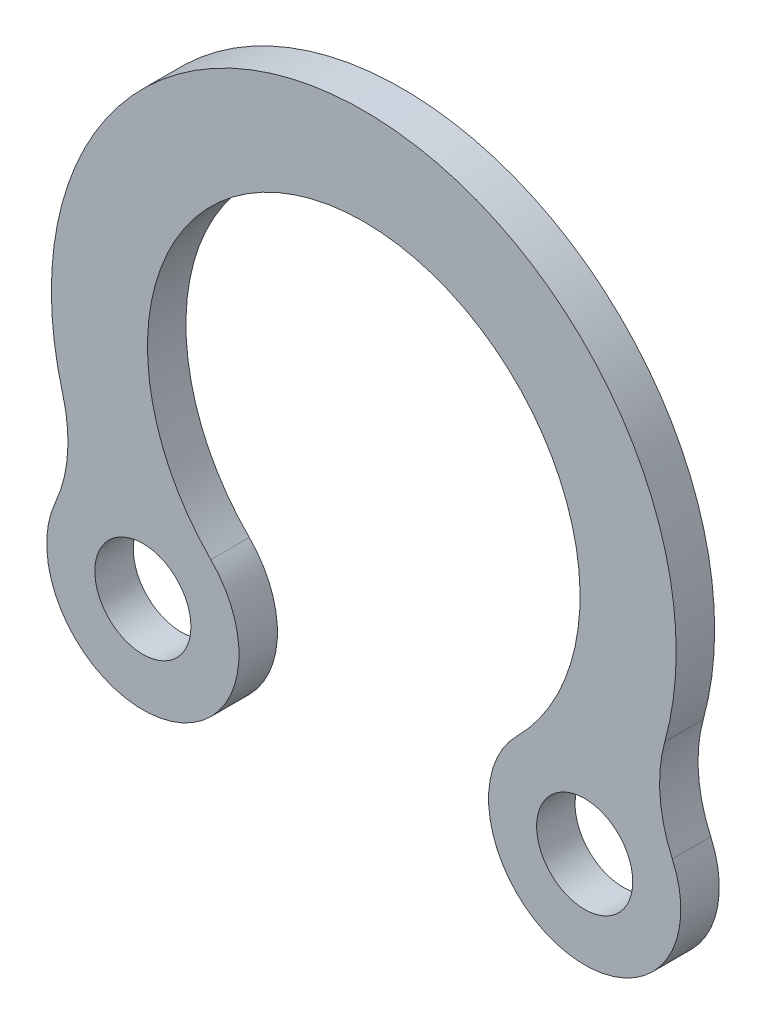
ISO-10303-21;
HEADER;
FILE_DESCRIPTION(('STEP AP214'),'2;1');
FILE_NAME('part.step','',(''),(''),'','','');
FILE_SCHEMA(('AUTOMOTIVE_DESIGN { 1 0 10303 214 1 1 1 1 }'));
ENDSEC;
DATA;
#1=APPLICATION_CONTEXT('core data for automotive mechanical design processes');
#2=APPLICATION_PROTOCOL_DEFINITION('international standard','automotive_design',2000,#1);
#3=PRODUCT_CONTEXT('',#1,'mechanical');
#4=PRODUCT('Part','Part','',(#3));
#5=PRODUCT_RELATED_PRODUCT_CATEGORY('part','',(#4));
#6=PRODUCT_DEFINITION_FORMATION('','',#4);
#7=PRODUCT_DEFINITION_CONTEXT('part definition',#1,'design');
#8=PRODUCT_DEFINITION('design','',#6,#7);
#9=PRODUCT_DEFINITION_SHAPE('','',#8);
#10=(LENGTH_UNIT() NAMED_UNIT(*) SI_UNIT(.MILLI.,.METRE.));
#11=(NAMED_UNIT(*) PLANE_ANGLE_UNIT() SI_UNIT($,.RADIAN.));
#12=(NAMED_UNIT(*) SI_UNIT($,.STERADIAN.) SOLID_ANGLE_UNIT());
#13=UNCERTAINTY_MEASURE_WITH_UNIT(LENGTH_MEASURE(1.E-05),#10,'distance_accuracy_value','');
#14=(GEOMETRIC_REPRESENTATION_CONTEXT(3) GLOBAL_UNCERTAINTY_ASSIGNED_CONTEXT((#13)) GLOBAL_UNIT_ASSIGNED_CONTEXT((#10,
#11,#12)) REPRESENTATION_CONTEXT('',''));
#15=CARTESIAN_POINT('',(0.,0.,0.));
#16=DIRECTION('',(0.,0.,1.));
#17=DIRECTION('',(1.,0.,0.));
#18=AXIS2_PLACEMENT_3D('',#15,#16,#17);
#19=CARTESIAN_POINT('',(0.,0.,0.8));
#20=DIRECTION('',(0.,0.,1.));
#21=DIRECTION('',(1.,0.,0.));
#22=AXIS2_PLACEMENT_3D('',#19,#20,#21);
#23=PLANE('',#22);
#24=CARTESIAN_POINT('',(-4.59619407771257,-4.59619407771255,0.8));
#25=DIRECTION('',(0.,0.,1.));
#26=DIRECTION('',(1.,0.,0.));
#27=AXIS2_PLACEMENT_3D('',#24,#25,#26);
#28=CIRCLE('',#27,1.);
#29=CARTESIAN_POINT('',(-3.59619407771257,-4.59619407771255,0.8));
#30=VERTEX_POINT('',#29);
#31=EDGE_CURVE('E156',#30,#30,#28,.T.);
#32=ORIENTED_EDGE('',*,*,#31,.F.);
#33=EDGE_LOOP('',(#32));
#34=FACE_BOUND('',#33,.T.);
#35=CARTESIAN_POINT('',(4.59619407771257,-4.59619407771255,0.8));
#36=DIRECTION('',(0.,0.,1.));
#37=DIRECTION('',(1.,0.,0.));
#38=AXIS2_PLACEMENT_3D('',#35,#36,#37);
#39=CIRCLE('',#38,1.);
#40=CARTESIAN_POINT('',(5.59619407771257,-4.59619407771255,0.8));
#41=VERTEX_POINT('',#40);
#42=EDGE_CURVE('E150',#41,#41,#39,.T.);
#43=ORIENTED_EDGE('',*,*,#42,.F.);
#44=EDGE_LOOP('',(#43));
#45=FACE_BOUND('',#44,.T.);
#46=CARTESIAN_POINT('',(0.,0.,0.8));
#47=DIRECTION('',(0.,0.,1.));
#48=DIRECTION('',(1.,0.,0.));
#49=AXIS2_PLACEMENT_3D('',#46,#47,#48);
#50=CIRCLE('',#49,6.5);
#51=CARTESIAN_POINT('',(6.26328155252438,-1.73818991879706,0.8));
#52=VERTEX_POINT('',#51);
#53=CARTESIAN_POINT('',(-6.26328155252438,-1.73818991879707,0.8));
#54=VERTEX_POINT('',#53);
#55=EDGE_CURVE('E117',#52,#54,#50,.T.);
#56=ORIENTED_EDGE('',*,*,#55,.T.);
#57=CARTESIAN_POINT('',(-9.15402688445872,-2.54043141978033,0.8));
#58=DIRECTION('',(0.,0.,1.));
#59=DIRECTION('',(1.,0.,0.));
#60=AXIS2_PLACEMENT_3D('',#57,#58,#59);
#61=CIRCLE('',#60,3.);
#62=CARTESIAN_POINT('',(-6.41932720041103,-3.77388901453966,0.8));
#63=VERTEX_POINT('',#62);
#64=EDGE_CURVE('E131',#54,#63,#61,.F.);
#65=ORIENTED_EDGE('',*,*,#64,.T.);
#66=CARTESIAN_POINT('',(-4.59619407771257,-4.59619407771255,0.8));
#67=DIRECTION('',(0.,0.,1.));
#68=DIRECTION('',(1.,0.,0.));
#69=AXIS2_PLACEMENT_3D('',#66,#67,#68);
#70=CIRCLE('',#69,2.);
#71=CARTESIAN_POINT('',(-3.18198051533947,-3.18198051533946,0.8));
#72=VERTEX_POINT('',#71);
#73=EDGE_CURVE('E94',#63,#72,#70,.T.);
#74=ORIENTED_EDGE('',*,*,#73,.T.);
#75=CARTESIAN_POINT('',(0.,0.,0.8));
#76=DIRECTION('',(0.,0.,1.));
#77=DIRECTION('',(1.,0.,0.));
#78=AXIS2_PLACEMENT_3D('',#75,#76,#77);
#79=CIRCLE('',#78,4.5);
#80=CARTESIAN_POINT('',(3.18198051533947,-3.18198051533946,0.8));
#81=VERTEX_POINT('',#80);
#82=EDGE_CURVE('E109',#81,#72,#79,.T.);
#83=ORIENTED_EDGE('',*,*,#82,.F.);
#84=CARTESIAN_POINT('',(4.59619407771257,-4.59619407771255,0.8));
#85=DIRECTION('',(0.,0.,1.));
#86=DIRECTION('',(1.,0.,0.));
#87=AXIS2_PLACEMENT_3D('',#84,#85,#86);
#88=CIRCLE('',#87,2.);
#89=CARTESIAN_POINT('',(6.41932720041103,-3.77388901453966,0.8));
#90=VERTEX_POINT('',#89);
#91=EDGE_CURVE('E95',#81,#90,#88,.T.);
#92=ORIENTED_EDGE('',*,*,#91,.T.);
#93=CARTESIAN_POINT('',(9.15402688445872,-2.54043141978033,0.8));
#94=DIRECTION('',(0.,0.,1.));
#95=DIRECTION('',(1.,0.,0.));
#96=AXIS2_PLACEMENT_3D('',#93,#94,#95);
#97=CIRCLE('',#96,3.);
#98=EDGE_CURVE('E11',#90,#52,#97,.F.);
#99=ORIENTED_EDGE('',*,*,#98,.T.);
#100=EDGE_LOOP('',(#56,#65,#74,#83,#92,#99));
#101=FACE_BOUND('',#100,.T.);
#102=ADVANCED_FACE('F39',(#34,#45,#101),#23,.T.);
#103=CARTESIAN_POINT('',(0.,0.,0.));
#104=DIRECTION('',(0.,0.,1.));
#105=DIRECTION('',(1.,0.,0.));
#106=AXIS2_PLACEMENT_3D('',#103,#104,#105);
#107=PLANE('',#106);
#108=CARTESIAN_POINT('',(-4.59619407771257,-4.59619407771255,0.));
#109=DIRECTION('',(0.,0.,1.));
#110=DIRECTION('',(1.,0.,0.));
#111=AXIS2_PLACEMENT_3D('',#108,#109,#110);
#112=CIRCLE('',#111,1.);
#113=CARTESIAN_POINT('',(-3.59619407771257,-4.59619407771255,0.));
#114=VERTEX_POINT('',#113);
#115=EDGE_CURVE('E104',#114,#114,#112,.T.);
#116=ORIENTED_EDGE('',*,*,#115,.T.);
#117=EDGE_LOOP('',(#116));
#118=FACE_BOUND('',#117,.T.);
#119=CARTESIAN_POINT('',(4.59619407771257,-4.59619407771255,0.));
#120=DIRECTION('',(0.,0.,1.));
#121=DIRECTION('',(1.,0.,0.));
#122=AXIS2_PLACEMENT_3D('',#119,#120,#121);
#123=CIRCLE('',#122,1.);
#124=CARTESIAN_POINT('',(5.59619407771257,-4.59619407771255,0.));
#125=VERTEX_POINT('',#124);
#126=EDGE_CURVE('E153',#125,#125,#123,.T.);
#127=ORIENTED_EDGE('',*,*,#126,.T.);
#128=EDGE_LOOP('',(#127));
#129=FACE_BOUND('',#128,.T.);
#130=CARTESIAN_POINT('',(0.,0.,0.));
#131=DIRECTION('',(0.,0.,1.));
#132=DIRECTION('',(1.,0.,0.));
#133=AXIS2_PLACEMENT_3D('',#130,#131,#132);
#134=CIRCLE('',#133,4.5);
#135=CARTESIAN_POINT('',(3.18198051533947,-3.18198051533946,0.));
#136=VERTEX_POINT('',#135);
#137=CARTESIAN_POINT('',(-3.18198051533947,-3.18198051533946,0.));
#138=VERTEX_POINT('',#137);
#139=EDGE_CURVE('E93',#136,#138,#134,.T.);
#140=ORIENTED_EDGE('',*,*,#139,.T.);
#141=CARTESIAN_POINT('',(-4.59619407771257,-4.59619407771255,0.));
#142=DIRECTION('',(0.,0.,1.));
#143=DIRECTION('',(1.,0.,0.));
#144=AXIS2_PLACEMENT_3D('',#141,#142,#143);
#145=CIRCLE('',#144,2.);
#146=CARTESIAN_POINT('',(-6.41932720041103,-3.77388901453966,0.));
#147=VERTEX_POINT('',#146);
#148=EDGE_CURVE('E110',#147,#138,#145,.T.);
#149=ORIENTED_EDGE('',*,*,#148,.F.);
#150=CARTESIAN_POINT('',(-9.15402688445872,-2.54043141978033,0.));
#151=DIRECTION('',(0.,0.,1.));
#152=DIRECTION('',(1.,0.,0.));
#153=AXIS2_PLACEMENT_3D('',#150,#151,#152);
#154=CIRCLE('',#153,3.);
#155=CARTESIAN_POINT('',(-6.26328155252438,-1.73818991879707,0.));
#156=VERTEX_POINT('',#155);
#157=EDGE_CURVE('E133',#147,#156,#154,.T.);
#158=ORIENTED_EDGE('',*,*,#157,.T.);
#159=CARTESIAN_POINT('',(0.,0.,0.));
#160=DIRECTION('',(0.,0.,1.));
#161=DIRECTION('',(1.,0.,0.));
#162=AXIS2_PLACEMENT_3D('',#159,#160,#161);
#163=CIRCLE('',#162,6.5);
#164=CARTESIAN_POINT('',(6.26328155252438,-1.73818991879706,0.));
#165=VERTEX_POINT('',#164);
#166=EDGE_CURVE('E112',#165,#156,#163,.T.);
#167=ORIENTED_EDGE('',*,*,#166,.F.);
#168=CARTESIAN_POINT('',(9.15402688445872,-2.54043141978033,0.));
#169=DIRECTION('',(0.,0.,1.));
#170=DIRECTION('',(1.,0.,0.));
#171=AXIS2_PLACEMENT_3D('',#168,#169,#170);
#172=CIRCLE('',#171,3.);
#173=CARTESIAN_POINT('',(6.41932720041103,-3.77388901453966,0.));
#174=VERTEX_POINT('',#173);
#175=EDGE_CURVE('E47',#165,#174,#172,.T.);
#176=ORIENTED_EDGE('',*,*,#175,.T.);
#177=CARTESIAN_POINT('',(4.59619407771257,-4.59619407771255,0.));
#178=DIRECTION('',(0.,0.,1.));
#179=DIRECTION('',(1.,0.,0.));
#180=AXIS2_PLACEMENT_3D('',#177,#178,#179);
#181=CIRCLE('',#180,2.);
#182=EDGE_CURVE('E88',#136,#174,#181,.T.);
#183=ORIENTED_EDGE('',*,*,#182,.F.);
#184=EDGE_LOOP('',(#140,#149,#158,#167,#176,#183));
#185=FACE_BOUND('',#184,.T.);
#186=ADVANCED_FACE('F90',(#118,#129,#185),#107,.F.);
#187=CARTESIAN_POINT('',(0.,0.,0.8));
#188=DIRECTION('',(0.,0.,-1.));
#189=DIRECTION('',(-1.,0.,0.));
#190=AXIS2_PLACEMENT_3D('',#187,#188,#189);
#191=CYLINDRICAL_SURFACE('',#190,6.5);
#192=ORIENTED_EDGE('',*,*,#166,.T.);
#193=DIRECTION('',(0.,0.,-1.));
#194=VECTOR('',#193,1.);
#195=CARTESIAN_POINT('',(-6.26328155252438,-1.73818991879707,0.8));
#196=LINE('',#195,#194);
#197=EDGE_CURVE('E125',#156,#54,#196,.F.);
#198=ORIENTED_EDGE('',*,*,#197,.T.);
#199=ORIENTED_EDGE('',*,*,#55,.F.);
#200=DIRECTION('',(0.,0.,-1.));
#201=VECTOR('',#200,1.);
#202=CARTESIAN_POINT('',(6.26328155252439,-1.73818991879706,0.8));
#203=LINE('',#202,#201);
#204=EDGE_CURVE('E120',#52,#165,#203,.T.);
#205=ORIENTED_EDGE('',*,*,#204,.T.);
#206=EDGE_LOOP('',(#192,#198,#199,#205));
#207=FACE_BOUND('',#206,.T.);
#208=ADVANCED_FACE('F139',(#207),#191,.T.);
#209=CARTESIAN_POINT('',(0.,0.,0.8));
#210=DIRECTION('',(0.,0.,-1.));
#211=DIRECTION('',(-1.,0.,0.));
#212=AXIS2_PLACEMENT_3D('',#209,#210,#211);
#213=CYLINDRICAL_SURFACE('',#212,4.5);
#214=DIRECTION('',(0.,0.,1.));
#215=VECTOR('',#214,1.);
#216=CARTESIAN_POINT('',(-3.18198051533947,-3.18198051533946,0.));
#217=LINE('',#216,#215);
#218=EDGE_CURVE('E103',#138,#72,#217,.T.);
#219=ORIENTED_EDGE('',*,*,#218,.F.);
#220=ORIENTED_EDGE('',*,*,#139,.F.);
#221=DIRECTION('',(0.,0.,1.));
#222=VECTOR('',#221,1.);
#223=CARTESIAN_POINT('',(3.18198051533947,-3.18198051533946,0.));
#224=LINE('',#223,#222);
#225=EDGE_CURVE('E98',#136,#81,#224,.T.);
#226=ORIENTED_EDGE('',*,*,#225,.T.);
#227=ORIENTED_EDGE('',*,*,#82,.T.);
#228=EDGE_LOOP('',(#219,#220,#226,#227));
#229=FACE_BOUND('',#228,.T.);
#230=ADVANCED_FACE('F107',(#229),#213,.F.);
#231=CARTESIAN_POINT('',(-4.59619407771257,-4.59619407771255,0.));
#232=DIRECTION('',(0.,0.,1.));
#233=DIRECTION('',(1.,0.,0.));
#234=AXIS2_PLACEMENT_3D('',#231,#232,#233);
#235=CYLINDRICAL_SURFACE('',#234,2.);
#236=ORIENTED_EDGE('',*,*,#73,.F.);
#237=DIRECTION('',(0.,0.,1.));
#238=VECTOR('',#237,1.);
#239=CARTESIAN_POINT('',(-6.41932720041103,-3.77388901453966,0.));
#240=LINE('',#239,#238);
#241=EDGE_CURVE('E128',#63,#147,#240,.F.);
#242=ORIENTED_EDGE('',*,*,#241,.T.);
#243=ORIENTED_EDGE('',*,*,#148,.T.);
#244=ORIENTED_EDGE('',*,*,#218,.T.);
#245=EDGE_LOOP('',(#236,#242,#243,#244));
#246=FACE_BOUND('',#245,.T.);
#247=ADVANCED_FACE('F146',(#246),#235,.T.);
#248=CARTESIAN_POINT('',(4.59619407771257,-4.59619407771255,0.));
#249=DIRECTION('',(0.,0.,1.));
#250=DIRECTION('',(1.,0.,0.));
#251=AXIS2_PLACEMENT_3D('',#248,#249,#250);
#252=CYLINDRICAL_SURFACE('',#251,2.);
#253=ORIENTED_EDGE('',*,*,#182,.T.);
#254=DIRECTION('',(0.,0.,1.));
#255=VECTOR('',#254,1.);
#256=CARTESIAN_POINT('',(6.41932720041103,-3.77388901453966,0.));
#257=LINE('',#256,#255);
#258=EDGE_CURVE('E60',#174,#90,#257,.T.);
#259=ORIENTED_EDGE('',*,*,#258,.T.);
#260=ORIENTED_EDGE('',*,*,#91,.F.);
#261=ORIENTED_EDGE('',*,*,#225,.F.);
#262=EDGE_LOOP('',(#253,#259,#260,#261));
#263=FACE_BOUND('',#262,.T.);
#264=ADVANCED_FACE('F99',(#263),#252,.T.);
#265=CARTESIAN_POINT('',(4.59619407771257,-4.59619407771255,0.));
#266=DIRECTION('',(0.,0.,1.));
#267=DIRECTION('',(1.,0.,0.));
#268=AXIS2_PLACEMENT_3D('',#265,#266,#267);
#269=CYLINDRICAL_SURFACE('',#268,1.);
#270=ORIENTED_EDGE('',*,*,#126,.F.);
#271=EDGE_LOOP('',(#270));
#272=FACE_BOUND('',#271,.T.);
#273=ORIENTED_EDGE('',*,*,#42,.T.);
#274=EDGE_LOOP('',(#273));
#275=FACE_BOUND('',#274,.T.);
#276=ADVANCED_FACE('F167',(#272,#275),#269,.F.);
#277=CARTESIAN_POINT('',(-4.59619407771257,-4.59619407771255,0.));
#278=DIRECTION('',(0.,0.,1.));
#279=DIRECTION('',(1.,0.,0.));
#280=AXIS2_PLACEMENT_3D('',#277,#278,#279);
#281=CYLINDRICAL_SURFACE('',#280,1.);
#282=ORIENTED_EDGE('',*,*,#115,.F.);
#283=EDGE_LOOP('',(#282));
#284=FACE_BOUND('',#283,.T.);
#285=ORIENTED_EDGE('',*,*,#31,.T.);
#286=EDGE_LOOP('',(#285));
#287=FACE_BOUND('',#286,.T.);
#288=ADVANCED_FACE('F164',(#284,#287),#281,.F.);
#289=CARTESIAN_POINT('',(-9.15402688445872,-2.54043141978033,0.));
#290=DIRECTION('',(0.,0.,-1.));
#291=DIRECTION('',(-1.,0.,0.));
#292=AXIS2_PLACEMENT_3D('',#289,#290,#291);
#293=CYLINDRICAL_SURFACE('',#292,3.);
#294=ORIENTED_EDGE('',*,*,#157,.F.);
#295=ORIENTED_EDGE('',*,*,#241,.F.);
#296=ORIENTED_EDGE('',*,*,#64,.F.);
#297=ORIENTED_EDGE('',*,*,#197,.F.);
#298=EDGE_LOOP('',(#294,#295,#296,#297));
#299=FACE_BOUND('',#298,.T.);
#300=ADVANCED_FACE('F142',(#299),#293,.F.);
#301=CARTESIAN_POINT('',(9.15402688445872,-2.54043141978033,0.));
#302=DIRECTION('',(0.,0.,1.));
#303=DIRECTION('',(1.,0.,0.));
#304=AXIS2_PLACEMENT_3D('',#301,#302,#303);
#305=CYLINDRICAL_SURFACE('',#304,3.);
#306=ORIENTED_EDGE('',*,*,#98,.F.);
#307=ORIENTED_EDGE('',*,*,#258,.F.);
#308=ORIENTED_EDGE('',*,*,#175,.F.);
#309=ORIENTED_EDGE('',*,*,#204,.F.);
#310=EDGE_LOOP('',(#306,#307,#308,#309));
#311=FACE_BOUND('',#310,.T.);
#312=ADVANCED_FACE('F41',(#311),#305,.F.);
#313=CLOSED_SHELL('',(#102,#186,#208,#230,#247,#264,#276,#288,#300,#312));
#314=MANIFOLD_SOLID_BREP('B2',#313);
#315=ADVANCED_BREP_SHAPE_REPRESENTATION('',(#18,#314),#14);
#316=SHAPE_DEFINITION_REPRESENTATION(#9,#315);
ENDSEC;
END-ISO-10303-21;
